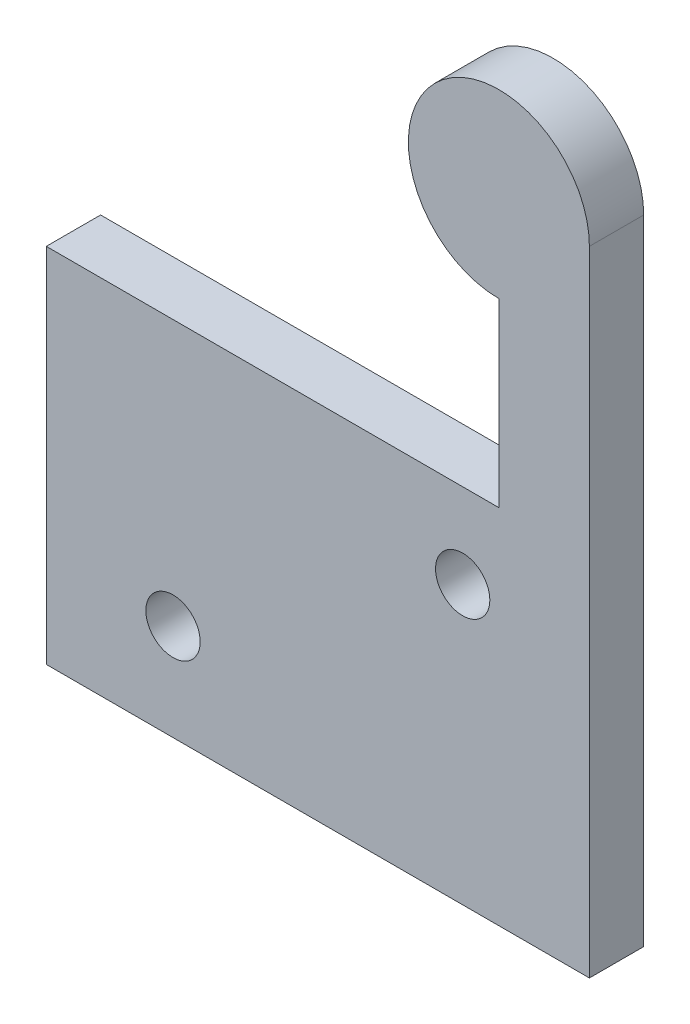
ISO-10303-21;
HEADER;
FILE_DESCRIPTION(('STEP AP214'),'2;1');
FILE_NAME('part.step','',(''),(''),'','','');
FILE_SCHEMA(('AUTOMOTIVE_DESIGN { 1 0 10303 214 1 1 1 1 }'));
ENDSEC;
DATA;
#1=APPLICATION_CONTEXT('core data for automotive mechanical design processes');
#2=APPLICATION_PROTOCOL_DEFINITION('international standard','automotive_design',2000,#1);
#3=PRODUCT_CONTEXT('',#1,'mechanical');
#4=PRODUCT('Part','Part','',(#3));
#5=PRODUCT_RELATED_PRODUCT_CATEGORY('part','',(#4));
#6=PRODUCT_DEFINITION_FORMATION('','',#4);
#7=PRODUCT_DEFINITION_CONTEXT('part definition',#1,'design');
#8=PRODUCT_DEFINITION('design','',#6,#7);
#9=PRODUCT_DEFINITION_SHAPE('','',#8);
#10=(LENGTH_UNIT() NAMED_UNIT(*) SI_UNIT(.MILLI.,.METRE.));
#11=(NAMED_UNIT(*) PLANE_ANGLE_UNIT() SI_UNIT($,.RADIAN.));
#12=(NAMED_UNIT(*) SI_UNIT($,.STERADIAN.) SOLID_ANGLE_UNIT());
#13=UNCERTAINTY_MEASURE_WITH_UNIT(LENGTH_MEASURE(1.E-05),#10,'distance_accuracy_value','');
#14=(GEOMETRIC_REPRESENTATION_CONTEXT(3) GLOBAL_UNCERTAINTY_ASSIGNED_CONTEXT((#13)) GLOBAL_UNIT_ASSIGNED_CONTEXT((#10,
#11,#12)) REPRESENTATION_CONTEXT('',''));
#15=CARTESIAN_POINT('',(0.,0.,0.));
#16=DIRECTION('',(0.,0.,1.));
#17=DIRECTION('',(1.,0.,0.));
#18=AXIS2_PLACEMENT_3D('',#15,#16,#17);
#19=CARTESIAN_POINT('',(14.9100826097598,4.67125805103712,3.));
#20=DIRECTION('',(0.,-1.,0.));
#21=DIRECTION('',(1.,0.,0.));
#22=AXIS2_PLACEMENT_3D('',#19,#20,#21);
#23=PLANE('',#22);
#24=DIRECTION('',(-1.,0.,0.));
#25=VECTOR('',#24,1.);
#26=CARTESIAN_POINT('',(14.9100826097598,4.67125805103712,0.));
#27=LINE('',#26,#25);
#28=CARTESIAN_POINT('',(14.9100826097598,4.67125805103712,0.));
#29=VERTEX_POINT('',#28);
#30=CARTESIAN_POINT('',(-10.0899173902402,4.67125805103712,0.));
#31=VERTEX_POINT('',#30);
#32=EDGE_CURVE('E117',#29,#31,#27,.T.);
#33=ORIENTED_EDGE('',*,*,#32,.T.);
#34=DIRECTION('',(0.,0.,-1.));
#35=VECTOR('',#34,1.);
#36=CARTESIAN_POINT('',(-10.0899173902402,4.67125805103712,3.));
#37=LINE('',#36,#35);
#38=CARTESIAN_POINT('',(-10.0899173902402,4.67125805103712,3.));
#39=VERTEX_POINT('',#38);
#40=EDGE_CURVE('E11',#39,#31,#37,.T.);
#41=ORIENTED_EDGE('',*,*,#40,.F.);
#42=DIRECTION('',(-1.,0.,0.));
#43=VECTOR('',#42,1.);
#44=CARTESIAN_POINT('',(14.9100826097598,4.67125805103712,3.));
#45=LINE('',#44,#43);
#46=CARTESIAN_POINT('',(14.9100826097598,4.67125805103712,3.));
#47=VERTEX_POINT('',#46);
#48=EDGE_CURVE('E129',#47,#39,#45,.T.);
#49=ORIENTED_EDGE('',*,*,#48,.F.);
#50=DIRECTION('',(0.,0.,-1.));
#51=VECTOR('',#50,1.);
#52=CARTESIAN_POINT('',(14.9100826097598,4.67125805103712,3.));
#53=LINE('',#52,#51);
#54=EDGE_CURVE('E113',#47,#29,#53,.T.);
#55=ORIENTED_EDGE('',*,*,#54,.T.);
#56=EDGE_LOOP('',(#33,#41,#49,#55));
#57=FACE_BOUND('',#56,.T.);
#58=ADVANCED_FACE('F32',(#57),#23,.F.);
#59=CARTESIAN_POINT('',(-10.0899173902402,4.67125805103712,3.));
#60=DIRECTION('',(1.,0.,0.));
#61=DIRECTION('',(0.,1.,0.));
#62=AXIS2_PLACEMENT_3D('',#59,#60,#61);
#63=PLANE('',#62);
#64=DIRECTION('',(0.,-1.,0.));
#65=VECTOR('',#64,1.);
#66=CARTESIAN_POINT('',(-10.0899173902402,4.67125805103712,0.));
#67=LINE('',#66,#65);
#68=CARTESIAN_POINT('',(-10.0899173902402,-15.3287419489629,0.));
#69=VERTEX_POINT('',#68);
#70=EDGE_CURVE('E120',#31,#69,#67,.T.);
#71=ORIENTED_EDGE('',*,*,#70,.T.);
#72=DIRECTION('',(0.,0.,-1.));
#73=VECTOR('',#72,1.);
#74=CARTESIAN_POINT('',(-10.0899173902402,-15.3287419489629,3.));
#75=LINE('',#74,#73);
#76=CARTESIAN_POINT('',(-10.0899173902402,-15.3287419489629,3.));
#77=VERTEX_POINT('',#76);
#78=EDGE_CURVE('E41',#77,#69,#75,.T.);
#79=ORIENTED_EDGE('',*,*,#78,.F.);
#80=DIRECTION('',(0.,-1.,0.));
#81=VECTOR('',#80,1.);
#82=CARTESIAN_POINT('',(-10.0899173902402,4.67125805103712,3.));
#83=LINE('',#82,#81);
#84=EDGE_CURVE('E87',#39,#77,#83,.T.);
#85=ORIENTED_EDGE('',*,*,#84,.F.);
#86=ORIENTED_EDGE('',*,*,#40,.T.);
#87=EDGE_LOOP('',(#71,#79,#85,#86));
#88=FACE_BOUND('',#87,.T.);
#89=ADVANCED_FACE('F149',(#88),#63,.F.);
#90=CARTESIAN_POINT('',(-10.0899173902402,-15.3287419489629,3.));
#91=DIRECTION('',(0.,1.,0.));
#92=DIRECTION('',(0.,0.,1.));
#93=AXIS2_PLACEMENT_3D('',#90,#91,#92);
#94=PLANE('',#93);
#95=DIRECTION('',(1.,0.,0.));
#96=VECTOR('',#95,1.);
#97=CARTESIAN_POINT('',(-10.0899173902402,-15.3287419489629,0.));
#98=LINE('',#97,#96);
#99=CARTESIAN_POINT('',(19.9100826097598,-15.3287419489629,0.));
#100=VERTEX_POINT('',#99);
#101=EDGE_CURVE('E123',#69,#100,#98,.T.);
#102=ORIENTED_EDGE('',*,*,#101,.T.);
#103=DIRECTION('',(0.,0.,-1.));
#104=VECTOR('',#103,1.);
#105=CARTESIAN_POINT('',(19.9100826097598,-15.3287419489629,3.));
#106=LINE('',#105,#104);
#107=CARTESIAN_POINT('',(19.9100826097598,-15.3287419489629,3.));
#108=VERTEX_POINT('',#107);
#109=EDGE_CURVE('E108',#108,#100,#106,.T.);
#110=ORIENTED_EDGE('',*,*,#109,.F.);
#111=DIRECTION('',(1.,0.,0.));
#112=VECTOR('',#111,1.);
#113=CARTESIAN_POINT('',(-10.0899173902402,-15.3287419489629,3.));
#114=LINE('',#113,#112);
#115=EDGE_CURVE('E100',#77,#108,#114,.T.);
#116=ORIENTED_EDGE('',*,*,#115,.F.);
#117=ORIENTED_EDGE('',*,*,#78,.T.);
#118=EDGE_LOOP('',(#102,#110,#116,#117));
#119=FACE_BOUND('',#118,.T.);
#120=ADVANCED_FACE('F152',(#119),#94,.F.);
#121=CARTESIAN_POINT('',(19.9100826097598,7.33913679629912,3.));
#122=DIRECTION('',(-1.,0.,0.));
#123=DIRECTION('',(0.,0.,1.));
#124=AXIS2_PLACEMENT_3D('',#121,#122,#123);
#125=PLANE('',#124);
#126=DIRECTION('',(0.,1.,0.));
#127=VECTOR('',#126,1.);
#128=CARTESIAN_POINT('',(19.9100826097598,7.33913679629912,0.));
#129=LINE('',#128,#127);
#130=CARTESIAN_POINT('',(19.9100826097598,19.6712580510371,0.));
#131=VERTEX_POINT('',#130);
#132=EDGE_CURVE('E107',#100,#131,#129,.T.);
#133=ORIENTED_EDGE('',*,*,#132,.T.);
#134=DIRECTION('',(0.,0.,-1.));
#135=VECTOR('',#134,1.);
#136=CARTESIAN_POINT('',(19.9100826097598,19.6712580510371,3.));
#137=LINE('',#136,#135);
#138=CARTESIAN_POINT('',(19.9100826097598,19.6712580510371,3.));
#139=VERTEX_POINT('',#138);
#140=EDGE_CURVE('E105',#139,#131,#137,.T.);
#141=ORIENTED_EDGE('',*,*,#140,.F.);
#142=DIRECTION('',(0.,1.,0.));
#143=VECTOR('',#142,1.);
#144=CARTESIAN_POINT('',(19.9100826097598,-15.3287419489629,3.));
#145=LINE('',#144,#143);
#146=EDGE_CURVE('E94',#108,#139,#145,.T.);
#147=ORIENTED_EDGE('',*,*,#146,.F.);
#148=ORIENTED_EDGE('',*,*,#109,.T.);
#149=EDGE_LOOP('',(#133,#141,#147,#148));
#150=FACE_BOUND('',#149,.T.);
#151=ADVANCED_FACE('F106',(#150),#125,.F.);
#152=CARTESIAN_POINT('',(14.9100826097598,19.6712580510371,3.));
#153=DIRECTION('',(0.,0.,-1.));
#154=DIRECTION('',(-1.,0.,0.));
#155=AXIS2_PLACEMENT_3D('',#152,#153,#154);
#156=CYLINDRICAL_SURFACE('',#155,5.);
#157=CARTESIAN_POINT('',(14.9100826097598,19.6712580510371,0.));
#158=DIRECTION('',(0.,0.,1.));
#159=DIRECTION('',(1.,0.,0.));
#160=AXIS2_PLACEMENT_3D('',#157,#158,#159);
#161=CIRCLE('',#160,5.);
#162=CARTESIAN_POINT('',(14.9100826097598,14.6712580510371,0.));
#163=VERTEX_POINT('',#162);
#164=EDGE_CURVE('E73',#131,#163,#161,.T.);
#165=ORIENTED_EDGE('',*,*,#164,.T.);
#166=DIRECTION('',(0.,0.,-1.));
#167=VECTOR('',#166,1.);
#168=CARTESIAN_POINT('',(14.9100826097598,14.6712580510371,3.));
#169=LINE('',#168,#167);
#170=CARTESIAN_POINT('',(14.9100826097598,14.6712580510371,3.));
#171=VERTEX_POINT('',#170);
#172=EDGE_CURVE('E109',#171,#163,#169,.T.);
#173=ORIENTED_EDGE('',*,*,#172,.F.);
#174=CARTESIAN_POINT('',(14.9100826097598,19.6712580510371,3.));
#175=DIRECTION('',(0.,0.,1.));
#176=DIRECTION('',(1.,0.,0.));
#177=AXIS2_PLACEMENT_3D('',#174,#175,#176);
#178=CIRCLE('',#177,5.);
#179=EDGE_CURVE('E98',#139,#171,#178,.T.);
#180=ORIENTED_EDGE('',*,*,#179,.F.);
#181=ORIENTED_EDGE('',*,*,#140,.T.);
#182=EDGE_LOOP('',(#165,#173,#180,#181));
#183=FACE_BOUND('',#182,.T.);
#184=ADVANCED_FACE('F111',(#183),#156,.T.);
#185=CARTESIAN_POINT('',(14.9100826097598,4.67125805103712,3.));
#186=DIRECTION('',(1.,0.,0.));
#187=DIRECTION('',(0.,1.,0.));
#188=AXIS2_PLACEMENT_3D('',#185,#186,#187);
#189=PLANE('',#188);
#190=DIRECTION('',(0.,-1.,0.));
#191=VECTOR('',#190,1.);
#192=CARTESIAN_POINT('',(14.9100826097598,4.67125805103712,0.));
#193=LINE('',#192,#191);
#194=EDGE_CURVE('E79',#163,#29,#193,.T.);
#195=ORIENTED_EDGE('',*,*,#194,.T.);
#196=ORIENTED_EDGE('',*,*,#54,.F.);
#197=DIRECTION('',(0.,-1.,0.));
#198=VECTOR('',#197,1.);
#199=CARTESIAN_POINT('',(14.9100826097598,4.67125805103712,3.));
#200=LINE('',#199,#198);
#201=EDGE_CURVE('E50',#171,#47,#200,.T.);
#202=ORIENTED_EDGE('',*,*,#201,.F.);
#203=ORIENTED_EDGE('',*,*,#172,.T.);
#204=EDGE_LOOP('',(#195,#196,#202,#203));
#205=FACE_BOUND('',#204,.T.);
#206=ADVANCED_FACE('F157',(#205),#189,.F.);
#207=CARTESIAN_POINT('',(14.9100826097598,19.6712580510371,3.));
#208=DIRECTION('',(0.,0.,1.));
#209=DIRECTION('',(1.,0.,0.));
#210=AXIS2_PLACEMENT_3D('',#207,#208,#209);
#211=PLANE('',#210);
#212=CARTESIAN_POINT('',(-3.08991739024018,-10.,3.));
#213=DIRECTION('',(0.,0.,1.));
#214=DIRECTION('',(1.,0.,0.));
#215=AXIS2_PLACEMENT_3D('',#212,#213,#214);
#216=CIRCLE('',#215,1.5);
#217=CARTESIAN_POINT('',(-1.58991739024018,-10.,3.));
#218=VERTEX_POINT('',#217);
#219=EDGE_CURVE('E143',#218,#218,#216,.T.);
#220=ORIENTED_EDGE('',*,*,#219,.F.);
#221=EDGE_LOOP('',(#220));
#222=FACE_BOUND('',#221,.T.);
#223=CARTESIAN_POINT('',(12.9100826097598,0.,3.));
#224=DIRECTION('',(0.,0.,1.));
#225=DIRECTION('',(1.,0.,0.));
#226=AXIS2_PLACEMENT_3D('',#223,#224,#225);
#227=CIRCLE('',#226,1.5);
#228=CARTESIAN_POINT('',(14.4100826097598,0.,3.));
#229=VERTEX_POINT('',#228);
#230=EDGE_CURVE('E135',#229,#229,#227,.T.);
#231=ORIENTED_EDGE('',*,*,#230,.F.);
#232=EDGE_LOOP('',(#231));
#233=FACE_BOUND('',#232,.T.);
#234=ORIENTED_EDGE('',*,*,#48,.T.);
#235=ORIENTED_EDGE('',*,*,#84,.T.);
#236=ORIENTED_EDGE('',*,*,#115,.T.);
#237=ORIENTED_EDGE('',*,*,#146,.T.);
#238=ORIENTED_EDGE('',*,*,#179,.T.);
#239=ORIENTED_EDGE('',*,*,#201,.T.);
#240=EDGE_LOOP('',(#234,#235,#236,#237,#238,#239));
#241=FACE_BOUND('',#240,.T.);
#242=ADVANCED_FACE('F96',(#222,#233,#241),#211,.T.);
#243=CARTESIAN_POINT('',(14.9100826097598,19.6712580510371,0.));
#244=DIRECTION('',(0.,0.,1.));
#245=DIRECTION('',(1.,0.,0.));
#246=AXIS2_PLACEMENT_3D('',#243,#244,#245);
#247=PLANE('',#246);
#248=CARTESIAN_POINT('',(-3.08991739024018,-10.,0.));
#249=DIRECTION('',(0.,0.,1.));
#250=DIRECTION('',(1.,0.,0.));
#251=AXIS2_PLACEMENT_3D('',#248,#249,#250);
#252=CIRCLE('',#251,1.5);
#253=CARTESIAN_POINT('',(-1.58991739024018,-10.,0.));
#254=VERTEX_POINT('',#253);
#255=EDGE_CURVE('E35',#254,#254,#252,.T.);
#256=ORIENTED_EDGE('',*,*,#255,.T.);
#257=EDGE_LOOP('',(#256));
#258=FACE_BOUND('',#257,.T.);
#259=CARTESIAN_POINT('',(12.9100826097598,0.,0.));
#260=DIRECTION('',(0.,0.,1.));
#261=DIRECTION('',(1.,0.,0.));
#262=AXIS2_PLACEMENT_3D('',#259,#260,#261);
#263=CIRCLE('',#262,1.5);
#264=CARTESIAN_POINT('',(14.4100826097598,0.,0.));
#265=VERTEX_POINT('',#264);
#266=EDGE_CURVE('E121',#265,#265,#263,.T.);
#267=ORIENTED_EDGE('',*,*,#266,.T.);
#268=EDGE_LOOP('',(#267));
#269=FACE_BOUND('',#268,.T.);
#270=ORIENTED_EDGE('',*,*,#32,.F.);
#271=ORIENTED_EDGE('',*,*,#194,.F.);
#272=ORIENTED_EDGE('',*,*,#164,.F.);
#273=ORIENTED_EDGE('',*,*,#132,.F.);
#274=ORIENTED_EDGE('',*,*,#101,.F.);
#275=ORIENTED_EDGE('',*,*,#70,.F.);
#276=EDGE_LOOP('',(#270,#271,#272,#273,#274,#275));
#277=FACE_BOUND('',#276,.T.);
#278=ADVANCED_FACE('F155',(#258,#269,#277),#247,.F.);
#279=CARTESIAN_POINT('',(12.9100826097598,0.,-3.));
#280=DIRECTION('',(0.,0.,1.));
#281=DIRECTION('',(1.,0.,0.));
#282=AXIS2_PLACEMENT_3D('',#279,#280,#281);
#283=CYLINDRICAL_SURFACE('',#282,1.5);
#284=ORIENTED_EDGE('',*,*,#230,.T.);
#285=EDGE_LOOP('',(#284));
#286=FACE_BOUND('',#285,.T.);
#287=ORIENTED_EDGE('',*,*,#266,.F.);
#288=EDGE_LOOP('',(#287));
#289=FACE_BOUND('',#288,.T.);
#290=ADVANCED_FACE('F205',(#286,#289),#283,.F.);
#291=CARTESIAN_POINT('',(-3.08991739024018,-10.,-3.));
#292=DIRECTION('',(0.,0.,1.));
#293=DIRECTION('',(1.,0.,0.));
#294=AXIS2_PLACEMENT_3D('',#291,#292,#293);
#295=CYLINDRICAL_SURFACE('',#294,1.5);
#296=ORIENTED_EDGE('',*,*,#219,.T.);
#297=EDGE_LOOP('',(#296));
#298=FACE_BOUND('',#297,.T.);
#299=ORIENTED_EDGE('',*,*,#255,.F.);
#300=EDGE_LOOP('',(#299));
#301=FACE_BOUND('',#300,.T.);
#302=ADVANCED_FACE('F214',(#298,#301),#295,.F.);
#303=CLOSED_SHELL('',(#58,#89,#120,#151,#184,#206,#242,#278,#290,#302));
#304=MANIFOLD_SOLID_BREP('B2',#303);
#305=ADVANCED_BREP_SHAPE_REPRESENTATION('',(#18,#304),#14);
#306=SHAPE_DEFINITION_REPRESENTATION(#9,#305);
ENDSEC;
END-ISO-10303-21;
